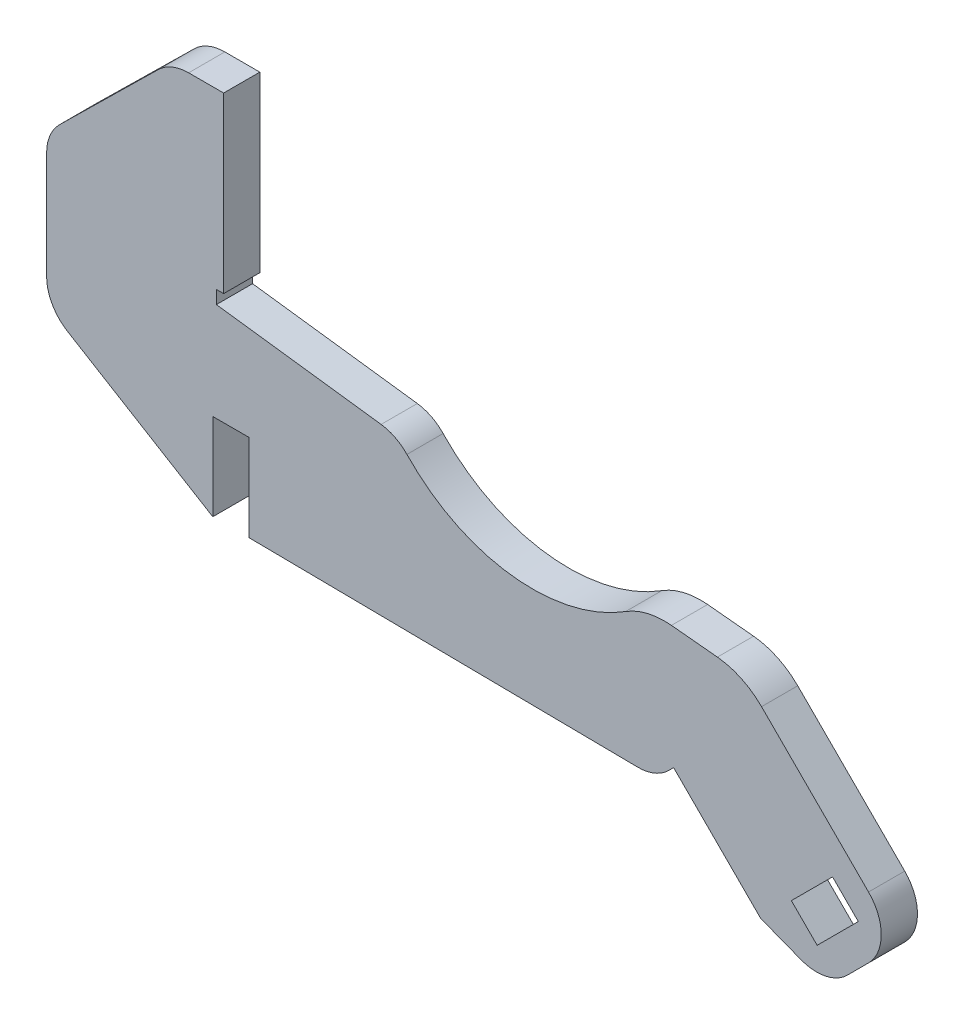
ISO-10303-21;
HEADER;
FILE_DESCRIPTION(('STEP AP214'),'2;1');
FILE_NAME('part.step','',(''),(''),'','','');
FILE_SCHEMA(('AUTOMOTIVE_DESIGN { 1 0 10303 214 1 1 1 1 }'));
ENDSEC;
DATA;
#1=APPLICATION_CONTEXT('core data for automotive mechanical design processes');
#2=APPLICATION_PROTOCOL_DEFINITION('international standard','automotive_design',2000,#1);
#3=PRODUCT_CONTEXT('',#1,'mechanical');
#4=PRODUCT('Part','Part','',(#3));
#5=PRODUCT_RELATED_PRODUCT_CATEGORY('part','',(#4));
#6=PRODUCT_DEFINITION_FORMATION('','',#4);
#7=PRODUCT_DEFINITION_CONTEXT('part definition',#1,'design');
#8=PRODUCT_DEFINITION('design','',#6,#7);
#9=PRODUCT_DEFINITION_SHAPE('','',#8);
#10=(LENGTH_UNIT() NAMED_UNIT(*) SI_UNIT(.MILLI.,.METRE.));
#11=(NAMED_UNIT(*) PLANE_ANGLE_UNIT() SI_UNIT($,.RADIAN.));
#12=(NAMED_UNIT(*) SI_UNIT($,.STERADIAN.) SOLID_ANGLE_UNIT());
#13=UNCERTAINTY_MEASURE_WITH_UNIT(LENGTH_MEASURE(1.E-05),#10,'distance_accuracy_value','');
#14=(GEOMETRIC_REPRESENTATION_CONTEXT(3) GLOBAL_UNCERTAINTY_ASSIGNED_CONTEXT((#13)) GLOBAL_UNIT_ASSIGNED_CONTEXT((#10,
#11,#12)) REPRESENTATION_CONTEXT('',''));
#15=CARTESIAN_POINT('',(0.,0.,0.));
#16=DIRECTION('',(0.,0.,1.));
#17=DIRECTION('',(1.,0.,0.));
#18=AXIS2_PLACEMENT_3D('',#15,#16,#17);
#19=CARTESIAN_POINT('',(2.08387210182843,-1.10005647116688,0.125));
#20=DIRECTION('',(0.,0.,1.));
#21=DIRECTION('',(1.,0.,0.));
#22=AXIS2_PLACEMENT_3D('',#19,#20,#21);
#23=PLANE('',#22);
#24=DIRECTION('',(-0.707106781186547,0.707106781186547,0.));
#25=VECTOR('',#24,1.);
#26=CARTESIAN_POINT('',(4.61670017436695,-3.16430284580979,0.125));
#27=LINE('',#26,#25);
#28=CARTESIAN_POINT('',(4.40456814001099,-2.95217081145382,0.125));
#29=VERTEX_POINT('',#28);
#30=CARTESIAN_POINT('',(3.6654602112381,-2.21306288268094,0.125));
#31=VERTEX_POINT('',#30);
#32=EDGE_CURVE('E311',#29,#31,#27,.T.);
#33=ORIENTED_EDGE('',*,*,#32,.T.);
#34=CARTESIAN_POINT('',(3.31190682064483,-2.56661627327421,0.125));
#35=DIRECTION('',(0.,0.,1.));
#36=DIRECTION('',(1.,0.,0.));
#37=AXIS2_PLACEMENT_3D('',#34,#35,#36);
#38=CIRCLE('',#37,0.5);
#39=CARTESIAN_POINT('',(3.36050678127505,-2.06898383479503,0.125));
#40=VERTEX_POINT('',#39);
#41=EDGE_CURVE('E40',#31,#40,#38,.T.);
#42=ORIENTED_EDGE('',*,*,#41,.T.);
#43=DIRECTION('',(-0.995264876958373,0.0971999212604389,0.));
#44=VECTOR('',#43,1.);
#45=CARTESIAN_POINT('',(3.53879301888837,-2.08639569033121,0.125));
#46=LINE('',#45,#44);
#47=CARTESIAN_POINT('',(3.04306244431306,-2.03798147022694,0.125));
#48=VERTEX_POINT('',#47);
#49=EDGE_CURVE('E313',#40,#48,#46,.T.);
#50=ORIENTED_EDGE('',*,*,#49,.T.);
#51=CARTESIAN_POINT('',(2.99446248368284,-2.53561390870612,0.125));
#52=DIRECTION('',(0.,0.,1.));
#53=DIRECTION('',(1.,0.,0.));
#54=AXIS2_PLACEMENT_3D('',#51,#52,#53);
#55=CIRCLE('',#54,0.5);
#56=CARTESIAN_POINT('',(2.72664178313742,-2.11339113295929,0.125));
#57=VERTEX_POINT('',#56);
#58=EDGE_CURVE('E47',#48,#57,#55,.T.);
#59=ORIENTED_EDGE('',*,*,#58,.T.);
#60=CARTESIAN_POINT('',(2.08387210182843,-1.10005647116688,0.125));
#61=DIRECTION('',(0.,0.,-1.));
#62=DIRECTION('',(1.,0.,0.));
#63=AXIS2_PLACEMENT_3D('',#60,#61,#62);
#64=CIRCLE('',#63,1.2);
#65=CARTESIAN_POINT('',(1.21603766591279,-1.92882869068138,0.125));
#66=VERTEX_POINT('',#65);
#67=EDGE_CURVE('E315',#57,#66,#64,.T.);
#68=ORIENTED_EDGE('',*,*,#67,.T.);
#69=CARTESIAN_POINT('',(0.999079056933884,-2.13602174556001,0.125));
#70=DIRECTION('',(0.,0.,1.));
#71=DIRECTION('',(1.,0.,0.));
#72=AXIS2_PLACEMENT_3D('',#69,#70,#71);
#73=CIRCLE('',#72,0.3);
#74=CARTESIAN_POINT('',(1.03774996099964,-1.83852458392861,0.125));
#75=VERTEX_POINT('',#74);
#76=EDGE_CURVE('E430',#66,#75,#73,.T.);
#77=ORIENTED_EDGE('',*,*,#76,.T.);
#78=DIRECTION('',(-0.991657205437985,0.128903013552536,0.));
#79=VECTOR('',#78,1.);
#80=CARTESIAN_POINT('',(1.14953079393391,-1.85305469185666,0.125));
#81=LINE('',#80,#79);
#82=CARTESIAN_POINT('',(-0.0999999999999998,-1.69063134235492,0.125));
#83=VERTEX_POINT('',#82);
#84=EDGE_CURVE('E317',#75,#83,#81,.T.);
#85=ORIENTED_EDGE('',*,*,#84,.T.);
#86=DIRECTION('',(0.,1.,0.));
#87=VECTOR('',#86,1.);
#88=CARTESIAN_POINT('',(-0.0999999999999998,-1.69063134235492,0.125));
#89=LINE('',#88,#87);
#90=CARTESIAN_POINT('',(-0.0999999999999999,-1.6,0.125));
#91=VERTEX_POINT('',#90);
#92=EDGE_CURVE('E319',#83,#91,#89,.T.);
#93=ORIENTED_EDGE('',*,*,#92,.T.);
#94=DIRECTION('',(1.,0.,0.));
#95=VECTOR('',#94,1.);
#96=CARTESIAN_POINT('',(-0.0999999999999999,-1.6,0.125));
#97=LINE('',#96,#95);
#98=CARTESIAN_POINT('',(-0.0499999999999998,-1.6,0.125));
#99=VERTEX_POINT('',#98);
#100=EDGE_CURVE('E321',#91,#99,#97,.T.);
#101=ORIENTED_EDGE('',*,*,#100,.T.);
#102=DIRECTION('',(0.,1.,0.));
#103=VECTOR('',#102,1.);
#104=CARTESIAN_POINT('',(-0.05,-0.4,0.125));
#105=LINE('',#104,#103);
#106=CARTESIAN_POINT('',(-0.05,-0.4,0.125));
#107=VERTEX_POINT('',#106);
#108=EDGE_CURVE('E323',#99,#107,#105,.T.);
#109=ORIENTED_EDGE('',*,*,#108,.T.);
#110=DIRECTION('',(-1.,0.,0.));
#111=VECTOR('',#110,1.);
#112=CARTESIAN_POINT('',(-0.05,-0.4,0.125));
#113=LINE('',#112,#111);
#114=CARTESIAN_POINT('',(-0.291663289582392,-0.4,0.125));
#115=VERTEX_POINT('',#114);
#116=EDGE_CURVE('E325',#107,#115,#113,.T.);
#117=ORIENTED_EDGE('',*,*,#116,.T.);
#118=CARTESIAN_POINT('',(-0.291663289582392,-0.7,0.125));
#119=DIRECTION('',(0.,0.,1.));
#120=DIRECTION('',(1.,0.,0.));
#121=AXIS2_PLACEMENT_3D('',#118,#119,#120);
#122=CIRCLE('',#121,0.3);
#123=CARTESIAN_POINT('',(-0.501990243174461,-0.48607811567612,0.125));
#124=VERTEX_POINT('',#123);
#125=EDGE_CURVE('E428',#115,#124,#122,.T.);
#126=ORIENTED_EDGE('',*,*,#125,.T.);
#127=DIRECTION('',(-0.713072947746268,-0.701089845306897,0.));
#128=VECTOR('',#127,1.);
#129=CARTESIAN_POINT('',(-0.414440871161026,-0.4,0.125));
#130=LINE('',#129,#128);
#131=CARTESIAN_POINT('',(-1.18302230113949,-1.15566551438029,0.125));
#132=VERTEX_POINT('',#131);
#133=EDGE_CURVE('E328',#124,#132,#130,.T.);
#134=ORIENTED_EDGE('',*,*,#133,.T.);
#135=CARTESIAN_POINT('',(-0.972695347547423,-1.36958739870417,0.125));
#136=DIRECTION('',(0.,0.,1.));
#137=DIRECTION('',(1.,0.,0.));
#138=AXIS2_PLACEMENT_3D('',#135,#136,#137);
#139=CIRCLE('',#138,0.3);
#140=CARTESIAN_POINT('',(-1.27269534754742,-1.36958739870417,0.125));
#141=VERTEX_POINT('',#140);
#142=EDGE_CURVE('E426',#132,#141,#139,.T.);
#143=ORIENTED_EDGE('',*,*,#142,.T.);
#144=DIRECTION('',(0.,-1.,0.));
#145=VECTOR('',#144,1.);
#146=CARTESIAN_POINT('',(-1.27269534754742,-1.24383161636612,0.125));
#147=LINE('',#146,#145);
#148=CARTESIAN_POINT('',(-1.27269534754742,-2.10871298110875,0.125));
#149=VERTEX_POINT('',#148);
#150=EDGE_CURVE('E286',#141,#149,#147,.T.);
#151=ORIENTED_EDGE('',*,*,#150,.T.);
#152=CARTESIAN_POINT('',(-0.972695347547423,-2.10871298110875,0.125));
#153=DIRECTION('',(0.,0.,1.));
#154=DIRECTION('',(1.,0.,0.));
#155=AXIS2_PLACEMENT_3D('',#152,#153,#154);
#156=CIRCLE('',#155,0.3);
#157=CARTESIAN_POINT('',(-1.12801596205259,-2.36537522357876,0.125));
#158=VERTEX_POINT('',#157);
#159=EDGE_CURVE('E424',#149,#158,#156,.T.);
#160=ORIENTED_EDGE('',*,*,#159,.T.);
#161=DIRECTION('',(0.855540808233388,-0.517735381683888,0.));
#162=VECTOR('',#161,1.);
#163=CARTESIAN_POINT('',(-1.27269534754742,-2.27782167131089,0.125));
#164=LINE('',#163,#162);
#165=CARTESIAN_POINT('',(-0.125,-2.97235603261887,0.125));
#166=VERTEX_POINT('',#165);
#167=EDGE_CURVE('E289',#158,#166,#164,.T.);
#168=ORIENTED_EDGE('',*,*,#167,.T.);
#169=DIRECTION('',(0.,1.,0.));
#170=VECTOR('',#169,1.);
#171=CARTESIAN_POINT('',(-0.125,-2.97235603261887,0.125));
#172=LINE('',#171,#170);
#173=CARTESIAN_POINT('',(-0.125,-2.37235603261887,0.125));
#174=VERTEX_POINT('',#173);
#175=EDGE_CURVE('E292',#166,#174,#172,.T.);
#176=ORIENTED_EDGE('',*,*,#175,.T.);
#177=DIRECTION('',(1.,0.,0.));
#178=VECTOR('',#177,1.);
#179=CARTESIAN_POINT('',(-0.125,-2.37235603261887,0.125));
#180=LINE('',#179,#178);
#181=CARTESIAN_POINT('',(0.125,-2.37235603261887,0.125));
#182=VERTEX_POINT('',#181);
#183=EDGE_CURVE('E294',#174,#182,#180,.T.);
#184=ORIENTED_EDGE('',*,*,#183,.T.);
#185=DIRECTION('',(0.,-1.,0.));
#186=VECTOR('',#185,1.);
#187=CARTESIAN_POINT('',(0.125,-2.37235603261887,0.125));
#188=LINE('',#187,#186);
#189=CARTESIAN_POINT('',(0.125,-2.97235603261887,0.125));
#190=VERTEX_POINT('',#189);
#191=EDGE_CURVE('E296',#182,#190,#188,.T.);
#192=ORIENTED_EDGE('',*,*,#191,.T.);
#193=DIRECTION('',(0.999936323133471,-0.0112849314713927,0.));
#194=VECTOR('',#193,1.);
#195=CARTESIAN_POINT('',(0.125,-2.97235603261887,0.125));
#196=LINE('',#195,#194);
#197=CARTESIAN_POINT('',(2.8093773347814,-3.0026509759723,0.125));
#198=VERTEX_POINT('',#197);
#199=EDGE_CURVE('E298',#190,#198,#196,.T.);
#200=ORIENTED_EDGE('',*,*,#199,.T.);
#201=CARTESIAN_POINT('',(2.81276281422281,-2.70267007903226,0.125));
#202=DIRECTION('',(0.,0.,1.));
#203=DIRECTION('',(1.,0.,0.));
#204=AXIS2_PLACEMENT_3D('',#201,#202,#203);
#205=CIRCLE('',#204,0.3);
#206=CARTESIAN_POINT('',(3.02489484857878,-2.91480211338822,0.125));
#207=VERTEX_POINT('',#206);
#208=EDGE_CURVE('E436',#198,#207,#205,.T.);
#209=ORIENTED_EDGE('',*,*,#208,.T.);
#210=DIRECTION('',(0.707106781186549,0.707106781186546,0.));
#211=VECTOR('',#210,1.);
#212=CARTESIAN_POINT('',(2.93562124143615,-3.00407572053085,0.125));
#213=LINE('',#212,#211);
#214=CARTESIAN_POINT('',(3.05823682863182,-2.88146013333518,0.125));
#215=VERTEX_POINT('',#214);
#216=EDGE_CURVE('E301',#207,#215,#213,.T.);
#217=ORIENTED_EDGE('',*,*,#216,.T.);
#218=DIRECTION('',(0.707106781186547,-0.707106781186547,0.));
#219=VECTOR('',#218,1.);
#220=CARTESIAN_POINT('',(3.05823682863182,-2.88146013333518,0.125));
#221=LINE('',#220,#219);
#222=CARTESIAN_POINT('',(3.65927759264038,-3.48250089734375,0.125));
#223=VERTEX_POINT('',#222);
#224=EDGE_CURVE('E303',#215,#223,#221,.T.);
#225=ORIENTED_EDGE('',*,*,#224,.T.);
#226=DIRECTION('',(0.93275440568332,-0.360512439006419,0.));
#227=VECTOR('',#226,1.);
#228=CARTESIAN_POINT('',(3.65927759264038,-3.48250089734375,0.125));
#229=LINE('',#228,#227);
#230=CARTESIAN_POINT('',(3.93813240410876,-3.59027913735913,0.125));
#231=VERTEX_POINT('',#230);
#232=EDGE_CURVE('E305',#223,#231,#229,.T.);
#233=ORIENTED_EDGE('',*,*,#232,.T.);
#234=CARTESIAN_POINT('',(4.04628613581068,-3.31045281565413,0.125));
#235=DIRECTION('',(0.,0.,1.));
#236=DIRECTION('',(1.,0.,0.));
#237=AXIS2_PLACEMENT_3D('',#234,#235,#236);
#238=CIRCLE('',#237,0.3);
#239=CARTESIAN_POINT('',(4.25841817016665,-3.52258485001009,0.125));
#240=VERTEX_POINT('',#239);
#241=EDGE_CURVE('E432',#231,#240,#238,.T.);
#242=ORIENTED_EDGE('',*,*,#241,.T.);
#243=DIRECTION('',(0.707106781186547,0.707106781186548,0.));
#244=VECTOR('',#243,1.);
#245=CARTESIAN_POINT('',(4.120311213974,-3.66069180620274,0.125));
#246=LINE('',#245,#244);
#247=CARTESIAN_POINT('',(4.40456814001099,-3.37643488016575,0.125));
#248=VERTEX_POINT('',#247);
#249=EDGE_CURVE('E308',#240,#248,#246,.T.);
#250=ORIENTED_EDGE('',*,*,#249,.T.);
#251=CARTESIAN_POINT('',(4.19243610565503,-3.16430284580979,0.125));
#252=DIRECTION('',(0.,0.,1.));
#253=DIRECTION('',(1.,0.,0.));
#254=AXIS2_PLACEMENT_3D('',#251,#252,#253);
#255=CIRCLE('',#254,0.3);
#256=EDGE_CURVE('E434',#248,#29,#255,.T.);
#257=ORIENTED_EDGE('',*,*,#256,.T.);
#258=EDGE_LOOP('',(#33,#42,#50,#59,#68,#77,#85,#93,#101,#109,#117,#126,#134,#143,#151,#160,#168,
#176,#184,#192,#200,#209,#217,#225,#233,#242,#250,#257));
#259=FACE_BOUND('',#258,.T.);
#260=DIRECTION('',(0.707106781186545,-0.70710678118655,0.));
#261=VECTOR('',#260,1.);
#262=CARTESIAN_POINT('',(3.87140962699635,-3.27036886298778,0.125));
#263=LINE('',#262,#261);
#264=CARTESIAN_POINT('',(3.87140962699635,-3.27036886298778,0.125));
#265=VERTEX_POINT('',#264);
#266=CARTESIAN_POINT('',(4.04960053585534,-3.44855977184678,0.125));
#267=VERTEX_POINT('',#266);
#268=EDGE_CURVE('E255',#265,#267,#263,.T.);
#269=ORIENTED_EDGE('',*,*,#268,.F.);
#270=DIRECTION('',(-0.707106781186509,-0.707106781186586,0.));
#271=VECTOR('',#270,1.);
#272=CARTESIAN_POINT('',(3.87140962699635,-3.27036886298778,0.125));
#273=LINE('',#272,#271);
#274=CARTESIAN_POINT('',(4.15566655303332,-2.98611193695078,0.125));
#275=VERTEX_POINT('',#274);
#276=EDGE_CURVE('E245',#275,#265,#273,.T.);
#277=ORIENTED_EDGE('',*,*,#276,.F.);
#278=DIRECTION('',(-0.707106781186543,0.707106781186552,0.));
#279=VECTOR('',#278,1.);
#280=CARTESIAN_POINT('',(4.15566655303332,-2.98611193695078,0.125));
#281=LINE('',#280,#279);
#282=CARTESIAN_POINT('',(4.33385746189233,-3.16430284580979,0.125));
#283=VERTEX_POINT('',#282);
#284=EDGE_CURVE('E270',#283,#275,#281,.T.);
#285=ORIENTED_EDGE('',*,*,#284,.F.);
#286=DIRECTION('',(0.707106781186547,0.707106781186549,0.));
#287=VECTOR('',#286,1.);
#288=CARTESIAN_POINT('',(4.04960053585534,-3.44855977184678,0.125));
#289=LINE('',#288,#287);
#290=EDGE_CURVE('E268',#267,#283,#289,.T.);
#291=ORIENTED_EDGE('',*,*,#290,.F.);
#292=EDGE_LOOP('',(#269,#277,#285,#291));
#293=FACE_BOUND('',#292,.T.);
#294=ADVANCED_FACE('F32',(#259,#293),#23,.T.);
#295=CARTESIAN_POINT('',(2.08387210182843,-1.10005647116688,-0.125));
#296=DIRECTION('',(0.,0.,1.));
#297=DIRECTION('',(1.,0.,0.));
#298=AXIS2_PLACEMENT_3D('',#295,#296,#297);
#299=PLANE('',#298);
#300=DIRECTION('',(-0.995264876958373,0.0971999212604389,0.));
#301=VECTOR('',#300,1.);
#302=CARTESIAN_POINT('',(3.53879301888837,-2.08639569033121,-0.125));
#303=LINE('',#302,#301);
#304=CARTESIAN_POINT('',(3.36050678127505,-2.06898383479503,-0.125));
#305=VERTEX_POINT('',#304);
#306=CARTESIAN_POINT('',(3.04306244431306,-2.03798147022694,-0.125));
#307=VERTEX_POINT('',#306);
#308=EDGE_CURVE('E357',#305,#307,#303,.T.);
#309=ORIENTED_EDGE('',*,*,#308,.F.);
#310=CARTESIAN_POINT('',(3.31190682064483,-2.56661627327421,-0.125));
#311=DIRECTION('',(0.,0.,1.));
#312=DIRECTION('',(1.,0.,0.));
#313=AXIS2_PLACEMENT_3D('',#310,#311,#312);
#314=CIRCLE('',#313,0.5);
#315=CARTESIAN_POINT('',(3.6654602112381,-2.21306288268094,-0.125));
#316=VERTEX_POINT('',#315);
#317=EDGE_CURVE('E476',#305,#316,#314,.F.);
#318=ORIENTED_EDGE('',*,*,#317,.T.);
#319=DIRECTION('',(-0.707106781186547,0.707106781186547,0.));
#320=VECTOR('',#319,1.);
#321=CARTESIAN_POINT('',(4.61670017436695,-3.16430284580979,-0.125));
#322=LINE('',#321,#320);
#323=CARTESIAN_POINT('',(4.40456814001099,-2.95217081145382,-0.125));
#324=VERTEX_POINT('',#323);
#325=EDGE_CURVE('E355',#324,#316,#322,.T.);
#326=ORIENTED_EDGE('',*,*,#325,.F.);
#327=CARTESIAN_POINT('',(4.19243610565503,-3.16430284580979,-0.125));
#328=DIRECTION('',(0.,0.,1.));
#329=DIRECTION('',(1.,0.,0.));
#330=AXIS2_PLACEMENT_3D('',#327,#328,#329);
#331=CIRCLE('',#330,0.3);
#332=CARTESIAN_POINT('',(4.40456814001099,-3.37643488016575,-0.125));
#333=VERTEX_POINT('',#332);
#334=EDGE_CURVE('E418',#324,#333,#331,.F.);
#335=ORIENTED_EDGE('',*,*,#334,.T.);
#336=DIRECTION('',(0.707106781186547,0.707106781186548,0.));
#337=VECTOR('',#336,1.);
#338=CARTESIAN_POINT('',(4.120311213974,-3.66069180620274,-0.125));
#339=LINE('',#338,#337);
#340=CARTESIAN_POINT('',(4.25841817016665,-3.52258485001009,-0.125));
#341=VERTEX_POINT('',#340);
#342=EDGE_CURVE('E352',#341,#333,#339,.T.);
#343=ORIENTED_EDGE('',*,*,#342,.F.);
#344=CARTESIAN_POINT('',(4.04628613581068,-3.31045281565413,-0.125));
#345=DIRECTION('',(0.,0.,1.));
#346=DIRECTION('',(1.,0.,0.));
#347=AXIS2_PLACEMENT_3D('',#344,#345,#346);
#348=CIRCLE('',#347,0.3);
#349=CARTESIAN_POINT('',(3.93813240410876,-3.59027913735913,-0.125));
#350=VERTEX_POINT('',#349);
#351=EDGE_CURVE('E416',#341,#350,#348,.F.);
#352=ORIENTED_EDGE('',*,*,#351,.T.);
#353=DIRECTION('',(0.93275440568332,-0.360512439006419,0.));
#354=VECTOR('',#353,1.);
#355=CARTESIAN_POINT('',(3.65927759264038,-3.48250089734375,-0.125));
#356=LINE('',#355,#354);
#357=CARTESIAN_POINT('',(3.65927759264038,-3.48250089734375,-0.125));
#358=VERTEX_POINT('',#357);
#359=EDGE_CURVE('E349',#358,#350,#356,.T.);
#360=ORIENTED_EDGE('',*,*,#359,.F.);
#361=DIRECTION('',(0.707106781186547,-0.707106781186547,0.));
#362=VECTOR('',#361,1.);
#363=CARTESIAN_POINT('',(3.05823682863182,-2.88146013333518,-0.125));
#364=LINE('',#363,#362);
#365=CARTESIAN_POINT('',(3.05823682863182,-2.88146013333518,-0.125));
#366=VERTEX_POINT('',#365);
#367=EDGE_CURVE('E347',#366,#358,#364,.T.);
#368=ORIENTED_EDGE('',*,*,#367,.F.);
#369=DIRECTION('',(0.707106781186549,0.707106781186546,0.));
#370=VECTOR('',#369,1.);
#371=CARTESIAN_POINT('',(2.93562124143615,-3.00407572053085,-0.125));
#372=LINE('',#371,#370);
#373=CARTESIAN_POINT('',(3.02489484857878,-2.91480211338822,-0.125));
#374=VERTEX_POINT('',#373);
#375=EDGE_CURVE('E345',#374,#366,#372,.T.);
#376=ORIENTED_EDGE('',*,*,#375,.F.);
#377=CARTESIAN_POINT('',(2.81276281422281,-2.70267007903226,-0.125));
#378=DIRECTION('',(0.,0.,1.));
#379=DIRECTION('',(1.,0.,0.));
#380=AXIS2_PLACEMENT_3D('',#377,#378,#379);
#381=CIRCLE('',#380,0.3);
#382=CARTESIAN_POINT('',(2.8093773347814,-3.0026509759723,-0.125));
#383=VERTEX_POINT('',#382);
#384=EDGE_CURVE('E420',#374,#383,#381,.F.);
#385=ORIENTED_EDGE('',*,*,#384,.T.);
#386=DIRECTION('',(0.999936323133471,-0.0112849314713927,0.));
#387=VECTOR('',#386,1.);
#388=CARTESIAN_POINT('',(0.125,-2.97235603261887,-0.125));
#389=LINE('',#388,#387);
#390=CARTESIAN_POINT('',(0.125,-2.97235603261887,-0.125));
#391=VERTEX_POINT('',#390);
#392=EDGE_CURVE('E342',#391,#383,#389,.T.);
#393=ORIENTED_EDGE('',*,*,#392,.F.);
#394=DIRECTION('',(0.,-1.,0.));
#395=VECTOR('',#394,1.);
#396=CARTESIAN_POINT('',(0.125,-2.37235603261887,-0.125));
#397=LINE('',#396,#395);
#398=CARTESIAN_POINT('',(0.125,-2.37235603261887,-0.125));
#399=VERTEX_POINT('',#398);
#400=EDGE_CURVE('E340',#399,#391,#397,.T.);
#401=ORIENTED_EDGE('',*,*,#400,.F.);
#402=DIRECTION('',(1.,0.,0.));
#403=VECTOR('',#402,1.);
#404=CARTESIAN_POINT('',(-0.125,-2.37235603261887,-0.125));
#405=LINE('',#404,#403);
#406=CARTESIAN_POINT('',(-0.125,-2.37235603261887,-0.125));
#407=VERTEX_POINT('',#406);
#408=EDGE_CURVE('E338',#407,#399,#405,.T.);
#409=ORIENTED_EDGE('',*,*,#408,.F.);
#410=DIRECTION('',(0.,1.,0.));
#411=VECTOR('',#410,1.);
#412=CARTESIAN_POINT('',(-0.125,-2.97235603261887,-0.125));
#413=LINE('',#412,#411);
#414=CARTESIAN_POINT('',(-0.125,-2.97235603261887,-0.125));
#415=VERTEX_POINT('',#414);
#416=EDGE_CURVE('E336',#415,#407,#413,.T.);
#417=ORIENTED_EDGE('',*,*,#416,.F.);
#418=DIRECTION('',(0.855540808233388,-0.517735381683888,0.));
#419=VECTOR('',#418,1.);
#420=CARTESIAN_POINT('',(-1.27269534754742,-2.27782167131089,-0.125));
#421=LINE('',#420,#419);
#422=CARTESIAN_POINT('',(-1.12801596205259,-2.36537522357876,-0.125));
#423=VERTEX_POINT('',#422);
#424=EDGE_CURVE('E334',#423,#415,#421,.T.);
#425=ORIENTED_EDGE('',*,*,#424,.F.);
#426=CARTESIAN_POINT('',(-0.972695347547423,-2.10871298110875,-0.125));
#427=DIRECTION('',(0.,0.,1.));
#428=DIRECTION('',(1.,0.,0.));
#429=AXIS2_PLACEMENT_3D('',#426,#427,#428);
#430=CIRCLE('',#429,0.3);
#431=CARTESIAN_POINT('',(-1.27269534754742,-2.10871298110875,-0.125));
#432=VERTEX_POINT('',#431);
#433=EDGE_CURVE('E407',#423,#432,#430,.F.);
#434=ORIENTED_EDGE('',*,*,#433,.T.);
#435=DIRECTION('',(0.,-1.,0.));
#436=VECTOR('',#435,1.);
#437=CARTESIAN_POINT('',(-1.27269534754742,-1.24383161636612,-0.125));
#438=LINE('',#437,#436);
#439=CARTESIAN_POINT('',(-1.27269534754742,-1.36958739870417,-0.125));
#440=VERTEX_POINT('',#439);
#441=EDGE_CURVE('E263',#440,#432,#438,.T.);
#442=ORIENTED_EDGE('',*,*,#441,.F.);
#443=CARTESIAN_POINT('',(-0.972695347547423,-1.36958739870417,-0.125));
#444=DIRECTION('',(0.,0.,1.));
#445=DIRECTION('',(1.,0.,0.));
#446=AXIS2_PLACEMENT_3D('',#443,#444,#445);
#447=CIRCLE('',#446,0.3);
#448=CARTESIAN_POINT('',(-1.18302230113949,-1.15566551438029,-0.125));
#449=VERTEX_POINT('',#448);
#450=EDGE_CURVE('E409',#440,#449,#447,.F.);
#451=ORIENTED_EDGE('',*,*,#450,.T.);
#452=DIRECTION('',(-0.713072947746268,-0.701089845306897,0.));
#453=VECTOR('',#452,1.);
#454=CARTESIAN_POINT('',(-0.414440871161026,-0.4,-0.125));
#455=LINE('',#454,#453);
#456=CARTESIAN_POINT('',(-0.501990243174461,-0.48607811567612,-0.125));
#457=VERTEX_POINT('',#456);
#458=EDGE_CURVE('E290',#457,#449,#455,.T.);
#459=ORIENTED_EDGE('',*,*,#458,.F.);
#460=CARTESIAN_POINT('',(-0.291663289582392,-0.7,-0.125));
#461=DIRECTION('',(0.,0.,1.));
#462=DIRECTION('',(1.,0.,0.));
#463=AXIS2_PLACEMENT_3D('',#460,#461,#462);
#464=CIRCLE('',#463,0.3);
#465=CARTESIAN_POINT('',(-0.291663289582392,-0.4,-0.125));
#466=VERTEX_POINT('',#465);
#467=EDGE_CURVE('E411',#457,#466,#464,.F.);
#468=ORIENTED_EDGE('',*,*,#467,.T.);
#469=DIRECTION('',(-1.,0.,0.));
#470=VECTOR('',#469,1.);
#471=CARTESIAN_POINT('',(-0.05,-0.4,-0.125));
#472=LINE('',#471,#470);
#473=CARTESIAN_POINT('',(-0.05,-0.4,-0.125));
#474=VERTEX_POINT('',#473);
#475=EDGE_CURVE('E370',#474,#466,#472,.T.);
#476=ORIENTED_EDGE('',*,*,#475,.F.);
#477=DIRECTION('',(0.,1.,0.));
#478=VECTOR('',#477,1.);
#479=CARTESIAN_POINT('',(-0.05,-0.4,-0.125));
#480=LINE('',#479,#478);
#481=CARTESIAN_POINT('',(-0.0499999999999998,-1.6,-0.125));
#482=VERTEX_POINT('',#481);
#483=EDGE_CURVE('E368',#482,#474,#480,.T.);
#484=ORIENTED_EDGE('',*,*,#483,.F.);
#485=DIRECTION('',(1.,0.,0.));
#486=VECTOR('',#485,1.);
#487=CARTESIAN_POINT('',(-0.0999999999999999,-1.6,-0.125));
#488=LINE('',#487,#486);
#489=CARTESIAN_POINT('',(-0.0999999999999999,-1.6,-0.125));
#490=VERTEX_POINT('',#489);
#491=EDGE_CURVE('E366',#490,#482,#488,.T.);
#492=ORIENTED_EDGE('',*,*,#491,.F.);
#493=DIRECTION('',(0.,1.,0.));
#494=VECTOR('',#493,1.);
#495=CARTESIAN_POINT('',(-0.0999999999999998,-1.69063134235492,-0.125));
#496=LINE('',#495,#494);
#497=CARTESIAN_POINT('',(-0.0999999999999998,-1.69063134235492,-0.125));
#498=VERTEX_POINT('',#497);
#499=EDGE_CURVE('E364',#498,#490,#496,.T.);
#500=ORIENTED_EDGE('',*,*,#499,.F.);
#501=DIRECTION('',(-0.991657205437985,0.128903013552536,0.));
#502=VECTOR('',#501,1.);
#503=CARTESIAN_POINT('',(1.14953079393391,-1.85305469185666,-0.125));
#504=LINE('',#503,#502);
#505=CARTESIAN_POINT('',(1.03774996099964,-1.83852458392861,-0.125));
#506=VERTEX_POINT('',#505);
#507=EDGE_CURVE('E362',#506,#498,#504,.T.);
#508=ORIENTED_EDGE('',*,*,#507,.F.);
#509=CARTESIAN_POINT('',(0.999079056933884,-2.13602174556001,-0.125));
#510=DIRECTION('',(0.,0.,1.));
#511=DIRECTION('',(1.,0.,0.));
#512=AXIS2_PLACEMENT_3D('',#509,#510,#511);
#513=CIRCLE('',#512,0.3);
#514=CARTESIAN_POINT('',(1.21603766591279,-1.92882869068138,-0.125));
#515=VERTEX_POINT('',#514);
#516=EDGE_CURVE('E413',#506,#515,#513,.F.);
#517=ORIENTED_EDGE('',*,*,#516,.T.);
#518=CARTESIAN_POINT('',(2.08387210182843,-1.10005647116688,-0.125));
#519=DIRECTION('',(0.,0.,-1.));
#520=DIRECTION('',(1.,0.,0.));
#521=AXIS2_PLACEMENT_3D('',#518,#519,#520);
#522=CIRCLE('',#521,1.2);
#523=CARTESIAN_POINT('',(2.72664178313742,-2.11339113295929,-0.125));
#524=VERTEX_POINT('',#523);
#525=EDGE_CURVE('E360',#524,#515,#522,.T.);
#526=ORIENTED_EDGE('',*,*,#525,.F.);
#527=CARTESIAN_POINT('',(2.99446248368284,-2.53561390870612,-0.125));
#528=DIRECTION('',(0.,0.,1.));
#529=DIRECTION('',(1.,0.,0.));
#530=AXIS2_PLACEMENT_3D('',#527,#528,#529);
#531=CIRCLE('',#530,0.5);
#532=EDGE_CURVE('E474',#524,#307,#531,.F.);
#533=ORIENTED_EDGE('',*,*,#532,.T.);
#534=EDGE_LOOP('',(#309,#318,#326,#335,#343,#352,#360,#368,#376,#385,#393,#401,#409,#417,#425,
#434,#442,#451,#459,#468,#476,#484,#492,#500,#508,#517,#526,#533));
#535=FACE_BOUND('',#534,.T.);
#536=DIRECTION('',(-0.707106781186509,-0.707106781186586,0.));
#537=VECTOR('',#536,1.);
#538=CARTESIAN_POINT('',(3.87140962699635,-3.27036886298778,-0.125));
#539=LINE('',#538,#537);
#540=CARTESIAN_POINT('',(4.15566655303332,-2.98611193695078,-0.125));
#541=VERTEX_POINT('',#540);
#542=CARTESIAN_POINT('',(3.87140962699635,-3.27036886298778,-0.125));
#543=VERTEX_POINT('',#542);
#544=EDGE_CURVE('E274',#541,#543,#539,.T.);
#545=ORIENTED_EDGE('',*,*,#544,.T.);
#546=DIRECTION('',(0.707106781186545,-0.70710678118655,0.));
#547=VECTOR('',#546,1.);
#548=CARTESIAN_POINT('',(3.87140962699635,-3.27036886298778,-0.125));
#549=LINE('',#548,#547);
#550=CARTESIAN_POINT('',(4.04960053585534,-3.44855977184678,-0.125));
#551=VERTEX_POINT('',#550);
#552=EDGE_CURVE('E262',#543,#551,#549,.T.);
#553=ORIENTED_EDGE('',*,*,#552,.T.);
#554=DIRECTION('',(0.707106781186547,0.707106781186549,0.));
#555=VECTOR('',#554,1.);
#556=CARTESIAN_POINT('',(4.04960053585534,-3.44855977184678,-0.125));
#557=LINE('',#556,#555);
#558=CARTESIAN_POINT('',(4.33385746189233,-3.16430284580979,-0.125));
#559=VERTEX_POINT('',#558);
#560=EDGE_CURVE('E277',#551,#559,#557,.T.);
#561=ORIENTED_EDGE('',*,*,#560,.T.);
#562=DIRECTION('',(-0.707106781186543,0.707106781186552,0.));
#563=VECTOR('',#562,1.);
#564=CARTESIAN_POINT('',(4.15566655303332,-2.98611193695078,-0.125));
#565=LINE('',#564,#563);
#566=EDGE_CURVE('E256',#559,#541,#565,.T.);
#567=ORIENTED_EDGE('',*,*,#566,.T.);
#568=EDGE_LOOP('',(#545,#553,#561,#567));
#569=FACE_BOUND('',#568,.T.);
#570=ADVANCED_FACE('F490',(#535,#569),#299,.F.);
#571=CARTESIAN_POINT('',(-1.27269534754742,-1.24383161636612,0.125));
#572=DIRECTION('',(1.,0.,0.));
#573=DIRECTION('',(0.,0.,-1.));
#574=AXIS2_PLACEMENT_3D('',#571,#572,#573);
#575=PLANE('',#574);
#576=ORIENTED_EDGE('',*,*,#150,.F.);
#577=DIRECTION('',(0.,0.,-1.));
#578=VECTOR('',#577,1.);
#579=CARTESIAN_POINT('',(-1.27269534754742,-1.36958739870417,0.125));
#580=LINE('',#579,#578);
#581=EDGE_CURVE('E463',#141,#440,#580,.T.);
#582=ORIENTED_EDGE('',*,*,#581,.T.);
#583=ORIENTED_EDGE('',*,*,#441,.T.);
#584=DIRECTION('',(0.,0.,-1.));
#585=VECTOR('',#584,1.);
#586=CARTESIAN_POINT('',(-1.27269534754742,-2.10871298110875,0.125));
#587=LINE('',#586,#585);
#588=EDGE_CURVE('E461',#432,#149,#587,.F.);
#589=ORIENTED_EDGE('',*,*,#588,.T.);
#590=EDGE_LOOP('',(#576,#582,#583,#589));
#591=FACE_BOUND('',#590,.T.);
#592=ADVANCED_FACE('F556',(#591),#575,.F.);
#593=CARTESIAN_POINT('',(-1.27269534754742,-2.27782167131089,0.125));
#594=DIRECTION('',(0.517735381683888,0.855540808233388,0.));
#595=DIRECTION('',(-0.855540808233388,0.517735381683888,0.));
#596=AXIS2_PLACEMENT_3D('',#593,#594,#595);
#597=PLANE('',#596);
#598=ORIENTED_EDGE('',*,*,#167,.F.);
#599=DIRECTION('',(0.,0.,-1.));
#600=VECTOR('',#599,1.);
#601=CARTESIAN_POINT('',(-1.12801596205259,-2.36537522357876,0.125));
#602=LINE('',#601,#600);
#603=EDGE_CURVE('E466',#158,#423,#602,.T.);
#604=ORIENTED_EDGE('',*,*,#603,.T.);
#605=ORIENTED_EDGE('',*,*,#424,.T.);
#606=DIRECTION('',(0.,0.,-1.));
#607=VECTOR('',#606,1.);
#608=CARTESIAN_POINT('',(-0.125,-2.97235603261887,0.125));
#609=LINE('',#608,#607);
#610=EDGE_CURVE('E401',#166,#415,#609,.T.);
#611=ORIENTED_EDGE('',*,*,#610,.F.);
#612=EDGE_LOOP('',(#598,#604,#605,#611));
#613=FACE_BOUND('',#612,.T.);
#614=ADVANCED_FACE('F549',(#613),#597,.F.);
#615=CARTESIAN_POINT('',(-0.125,-2.97235603261887,0.125));
#616=DIRECTION('',(-1.,0.,0.));
#617=DIRECTION('',(0.,0.,1.));
#618=AXIS2_PLACEMENT_3D('',#615,#616,#617);
#619=PLANE('',#618);
#620=ORIENTED_EDGE('',*,*,#416,.T.);
#621=DIRECTION('',(0.,0.,-1.));
#622=VECTOR('',#621,1.);
#623=CARTESIAN_POINT('',(-0.125,-2.37235603261887,0.125));
#624=LINE('',#623,#622);
#625=EDGE_CURVE('E398',#174,#407,#624,.T.);
#626=ORIENTED_EDGE('',*,*,#625,.F.);
#627=ORIENTED_EDGE('',*,*,#175,.F.);
#628=ORIENTED_EDGE('',*,*,#610,.T.);
#629=EDGE_LOOP('',(#620,#626,#627,#628));
#630=FACE_BOUND('',#629,.T.);
#631=ADVANCED_FACE('F545',(#630),#619,.F.);
#632=CARTESIAN_POINT('',(-0.125,-2.37235603261887,0.125));
#633=DIRECTION('',(0.,1.,0.));
#634=DIRECTION('',(0.,0.,1.));
#635=AXIS2_PLACEMENT_3D('',#632,#633,#634);
#636=PLANE('',#635);
#637=ORIENTED_EDGE('',*,*,#408,.T.);
#638=DIRECTION('',(0.,0.,-1.));
#639=VECTOR('',#638,1.);
#640=CARTESIAN_POINT('',(0.125,-2.37235603261887,0.125));
#641=LINE('',#640,#639);
#642=EDGE_CURVE('E395',#182,#399,#641,.T.);
#643=ORIENTED_EDGE('',*,*,#642,.F.);
#644=ORIENTED_EDGE('',*,*,#183,.F.);
#645=ORIENTED_EDGE('',*,*,#625,.T.);
#646=EDGE_LOOP('',(#637,#643,#644,#645));
#647=FACE_BOUND('',#646,.T.);
#648=ADVANCED_FACE('F541',(#647),#636,.F.);
#649=CARTESIAN_POINT('',(0.125,-2.37235603261887,0.125));
#650=DIRECTION('',(1.,0.,0.));
#651=DIRECTION('',(0.,0.,-1.));
#652=AXIS2_PLACEMENT_3D('',#649,#650,#651);
#653=PLANE('',#652);
#654=ORIENTED_EDGE('',*,*,#400,.T.);
#655=DIRECTION('',(0.,0.,-1.));
#656=VECTOR('',#655,1.);
#657=CARTESIAN_POINT('',(0.125,-2.97235603261887,0.125));
#658=LINE('',#657,#656);
#659=EDGE_CURVE('E392',#190,#391,#658,.T.);
#660=ORIENTED_EDGE('',*,*,#659,.F.);
#661=ORIENTED_EDGE('',*,*,#191,.F.);
#662=ORIENTED_EDGE('',*,*,#642,.T.);
#663=EDGE_LOOP('',(#654,#660,#661,#662));
#664=FACE_BOUND('',#663,.T.);
#665=ADVANCED_FACE('F535',(#664),#653,.F.);
#666=CARTESIAN_POINT('',(0.125,-2.97235603261887,0.125));
#667=DIRECTION('',(0.0112849314713927,0.999936323133471,0.));
#668=DIRECTION('',(-0.999936323133471,0.0112849314713927,0.));
#669=AXIS2_PLACEMENT_3D('',#666,#667,#668);
#670=PLANE('',#669);
#671=ORIENTED_EDGE('',*,*,#392,.T.);
#672=DIRECTION('',(0.,0.,-1.));
#673=VECTOR('',#672,1.);
#674=CARTESIAN_POINT('',(2.8093773347814,-3.0026509759723,0.125));
#675=LINE('',#674,#673);
#676=EDGE_CURVE('E422',#383,#198,#675,.F.);
#677=ORIENTED_EDGE('',*,*,#676,.T.);
#678=ORIENTED_EDGE('',*,*,#199,.F.);
#679=ORIENTED_EDGE('',*,*,#659,.T.);
#680=EDGE_LOOP('',(#671,#677,#678,#679));
#681=FACE_BOUND('',#680,.T.);
#682=ADVANCED_FACE('F529',(#681),#670,.F.);
#683=CARTESIAN_POINT('',(2.93562124143615,-3.00407572053085,0.125));
#684=DIRECTION('',(-0.707106781186546,0.707106781186549,0.));
#685=DIRECTION('',(-0.707106781186549,-0.707106781186546,0.));
#686=AXIS2_PLACEMENT_3D('',#683,#684,#685);
#687=PLANE('',#686);
#688=ORIENTED_EDGE('',*,*,#216,.F.);
#689=DIRECTION('',(0.,0.,-1.));
#690=VECTOR('',#689,1.);
#691=CARTESIAN_POINT('',(3.02489484857878,-2.91480211338822,0.125));
#692=LINE('',#691,#690);
#693=EDGE_CURVE('E404',#207,#374,#692,.T.);
#694=ORIENTED_EDGE('',*,*,#693,.T.);
#695=ORIENTED_EDGE('',*,*,#375,.T.);
#696=DIRECTION('',(0.,0.,-1.));
#697=VECTOR('',#696,1.);
#698=CARTESIAN_POINT('',(3.05823682863182,-2.88146013333518,0.125));
#699=LINE('',#698,#697);
#700=EDGE_CURVE('E389',#215,#366,#699,.T.);
#701=ORIENTED_EDGE('',*,*,#700,.F.);
#702=EDGE_LOOP('',(#688,#694,#695,#701));
#703=FACE_BOUND('',#702,.T.);
#704=ADVANCED_FACE('F521',(#703),#687,.F.);
#705=CARTESIAN_POINT('',(3.05823682863182,-2.88146013333518,0.125));
#706=DIRECTION('',(0.707106781186547,0.707106781186547,0.));
#707=DIRECTION('',(-0.707106781186548,0.707106781186548,0.));
#708=AXIS2_PLACEMENT_3D('',#705,#706,#707);
#709=PLANE('',#708);
#710=ORIENTED_EDGE('',*,*,#367,.T.);
#711=DIRECTION('',(0.,0.,-1.));
#712=VECTOR('',#711,1.);
#713=CARTESIAN_POINT('',(3.65927759264038,-3.48250089734375,0.125));
#714=LINE('',#713,#712);
#715=EDGE_CURVE('E386',#223,#358,#714,.T.);
#716=ORIENTED_EDGE('',*,*,#715,.F.);
#717=ORIENTED_EDGE('',*,*,#224,.F.);
#718=ORIENTED_EDGE('',*,*,#700,.T.);
#719=EDGE_LOOP('',(#710,#716,#717,#718));
#720=FACE_BOUND('',#719,.T.);
#721=ADVANCED_FACE('F515',(#720),#709,.F.);
#722=CARTESIAN_POINT('',(3.65927759264038,-3.48250089734375,0.125));
#723=DIRECTION('',(0.360512439006419,0.93275440568332,0.));
#724=DIRECTION('',(-0.93275440568332,0.360512439006419,0.));
#725=AXIS2_PLACEMENT_3D('',#722,#723,#724);
#726=PLANE('',#725);
#727=ORIENTED_EDGE('',*,*,#359,.T.);
#728=DIRECTION('',(0.,0.,-1.));
#729=VECTOR('',#728,1.);
#730=CARTESIAN_POINT('',(3.93813240410876,-3.59027913735913,0.125));
#731=LINE('',#730,#729);
#732=EDGE_CURVE('E446',#350,#231,#731,.F.);
#733=ORIENTED_EDGE('',*,*,#732,.T.);
#734=ORIENTED_EDGE('',*,*,#232,.F.);
#735=ORIENTED_EDGE('',*,*,#715,.T.);
#736=EDGE_LOOP('',(#727,#733,#734,#735));
#737=FACE_BOUND('',#736,.T.);
#738=ADVANCED_FACE('F510',(#737),#726,.F.);
#739=CARTESIAN_POINT('',(4.120311213974,-3.66069180620274,0.125));
#740=DIRECTION('',(-0.707106781186548,0.707106781186547,0.));
#741=DIRECTION('',(-0.707106781186547,-0.707106781186548,0.));
#742=AXIS2_PLACEMENT_3D('',#739,#740,#741);
#743=PLANE('',#742);
#744=ORIENTED_EDGE('',*,*,#342,.T.);
#745=DIRECTION('',(0.,0.,-1.));
#746=VECTOR('',#745,1.);
#747=CARTESIAN_POINT('',(4.40456814001099,-3.37643488016575,0.125));
#748=LINE('',#747,#746);
#749=EDGE_CURVE('E444',#333,#248,#748,.F.);
#750=ORIENTED_EDGE('',*,*,#749,.T.);
#751=ORIENTED_EDGE('',*,*,#249,.F.);
#752=DIRECTION('',(0.,0.,-1.));
#753=VECTOR('',#752,1.);
#754=CARTESIAN_POINT('',(4.25841817016665,-3.52258485001009,0.125));
#755=LINE('',#754,#753);
#756=EDGE_CURVE('E441',#240,#341,#755,.T.);
#757=ORIENTED_EDGE('',*,*,#756,.T.);
#758=EDGE_LOOP('',(#744,#750,#751,#757));
#759=FACE_BOUND('',#758,.T.);
#760=ADVANCED_FACE('F500',(#759),#743,.F.);
#761=CARTESIAN_POINT('',(4.61670017436695,-3.16430284580979,0.125));
#762=DIRECTION('',(-0.707106781186547,-0.707106781186547,0.));
#763=DIRECTION('',(0.707106781186548,-0.707106781186548,0.));
#764=AXIS2_PLACEMENT_3D('',#761,#762,#763);
#765=PLANE('',#764);
#766=ORIENTED_EDGE('',*,*,#325,.T.);
#767=DIRECTION('',(0.,0.,-1.));
#768=VECTOR('',#767,1.);
#769=CARTESIAN_POINT('',(3.6654602112381,-2.21306288268094,0.125));
#770=LINE('',#769,#768);
#771=EDGE_CURVE('E55',#316,#31,#770,.F.);
#772=ORIENTED_EDGE('',*,*,#771,.T.);
#773=ORIENTED_EDGE('',*,*,#32,.F.);
#774=DIRECTION('',(0.,0.,-1.));
#775=VECTOR('',#774,1.);
#776=CARTESIAN_POINT('',(4.40456814001099,-2.95217081145382,0.125));
#777=LINE('',#776,#775);
#778=EDGE_CURVE('E438',#29,#324,#777,.T.);
#779=ORIENTED_EDGE('',*,*,#778,.T.);
#780=EDGE_LOOP('',(#766,#772,#773,#779));
#781=FACE_BOUND('',#780,.T.);
#782=ADVANCED_FACE('F492',(#781),#765,.F.);
#783=CARTESIAN_POINT('',(3.53879301888837,-2.08639569033121,0.125));
#784=DIRECTION('',(-0.0971999212604389,-0.995264876958373,0.));
#785=DIRECTION('',(0.995264876958373,-0.0971999212604389,0.));
#786=AXIS2_PLACEMENT_3D('',#783,#784,#785);
#787=PLANE('',#786);
#788=ORIENTED_EDGE('',*,*,#49,.F.);
#789=DIRECTION('',(0.,0.,-1.));
#790=VECTOR('',#789,1.);
#791=CARTESIAN_POINT('',(3.36050678127505,-2.06898383479503,0.125));
#792=LINE('',#791,#790);
#793=EDGE_CURVE('E471',#40,#305,#792,.T.);
#794=ORIENTED_EDGE('',*,*,#793,.T.);
#795=ORIENTED_EDGE('',*,*,#308,.T.);
#796=DIRECTION('',(0.,0.,-1.));
#797=VECTOR('',#796,1.);
#798=CARTESIAN_POINT('',(3.04306244431306,-2.03798147022694,0.125));
#799=LINE('',#798,#797);
#800=EDGE_CURVE('E469',#307,#48,#799,.F.);
#801=ORIENTED_EDGE('',*,*,#800,.T.);
#802=EDGE_LOOP('',(#788,#794,#795,#801));
#803=FACE_BOUND('',#802,.T.);
#804=ADVANCED_FACE('F484',(#803),#787,.F.);
#805=CARTESIAN_POINT('',(2.08387210182843,-1.10005647116688,0.125));
#806=DIRECTION('',(0.,0.,-1.));
#807=DIRECTION('',(-1.,0.,0.));
#808=AXIS2_PLACEMENT_3D('',#805,#806,#807);
#809=CYLINDRICAL_SURFACE('',#808,1.2);
#810=ORIENTED_EDGE('',*,*,#67,.F.);
#811=DIRECTION('',(0.,0.,-1.));
#812=VECTOR('',#811,1.);
#813=CARTESIAN_POINT('',(2.72664178313742,-2.11339113295929,0.125));
#814=LINE('',#813,#812);
#815=EDGE_CURVE('E11',#57,#524,#814,.T.);
#816=ORIENTED_EDGE('',*,*,#815,.T.);
#817=ORIENTED_EDGE('',*,*,#525,.T.);
#818=DIRECTION('',(0.,0.,-1.));
#819=VECTOR('',#818,1.);
#820=CARTESIAN_POINT('',(1.21603766591279,-1.92882869068138,0.125));
#821=LINE('',#820,#819);
#822=EDGE_CURVE('E451',#515,#66,#821,.F.);
#823=ORIENTED_EDGE('',*,*,#822,.T.);
#824=EDGE_LOOP('',(#810,#816,#817,#823));
#825=FACE_BOUND('',#824,.T.);
#826=ADVANCED_FACE('F604',(#825),#809,.F.);
#827=CARTESIAN_POINT('',(1.14953079393391,-1.85305469185666,0.125));
#828=DIRECTION('',(-0.128903013552536,-0.991657205437985,0.));
#829=DIRECTION('',(0.991657205437985,-0.128903013552536,0.));
#830=AXIS2_PLACEMENT_3D('',#827,#828,#829);
#831=PLANE('',#830);
#832=ORIENTED_EDGE('',*,*,#84,.F.);
#833=DIRECTION('',(0.,0.,-1.));
#834=VECTOR('',#833,1.);
#835=CARTESIAN_POINT('',(1.03774996099964,-1.83852458392861,0.125));
#836=LINE('',#835,#834);
#837=EDGE_CURVE('E448',#75,#506,#836,.T.);
#838=ORIENTED_EDGE('',*,*,#837,.T.);
#839=ORIENTED_EDGE('',*,*,#507,.T.);
#840=DIRECTION('',(0.,0.,-1.));
#841=VECTOR('',#840,1.);
#842=CARTESIAN_POINT('',(-0.0999999999999998,-1.69063134235492,0.125));
#843=LINE('',#842,#841);
#844=EDGE_CURVE('E383',#83,#498,#843,.T.);
#845=ORIENTED_EDGE('',*,*,#844,.F.);
#846=EDGE_LOOP('',(#832,#838,#839,#845));
#847=FACE_BOUND('',#846,.T.);
#848=ADVANCED_FACE('F596',(#847),#831,.F.);
#849=CARTESIAN_POINT('',(-0.0999999999999998,-1.69063134235492,0.125));
#850=DIRECTION('',(-1.,0.,0.));
#851=DIRECTION('',(0.,-1.,0.));
#852=AXIS2_PLACEMENT_3D('',#849,#850,#851);
#853=PLANE('',#852);
#854=ORIENTED_EDGE('',*,*,#499,.T.);
#855=DIRECTION('',(0.,0.,-1.));
#856=VECTOR('',#855,1.);
#857=CARTESIAN_POINT('',(-0.0999999999999999,-1.6,0.125));
#858=LINE('',#857,#856);
#859=EDGE_CURVE('E380',#91,#490,#858,.T.);
#860=ORIENTED_EDGE('',*,*,#859,.F.);
#861=ORIENTED_EDGE('',*,*,#92,.F.);
#862=ORIENTED_EDGE('',*,*,#844,.T.);
#863=EDGE_LOOP('',(#854,#860,#861,#862));
#864=FACE_BOUND('',#863,.T.);
#865=ADVANCED_FACE('F592',(#864),#853,.F.);
#866=CARTESIAN_POINT('',(-0.0999999999999999,-1.6,0.125));
#867=DIRECTION('',(0.,1.,0.));
#868=DIRECTION('',(0.,0.,1.));
#869=AXIS2_PLACEMENT_3D('',#866,#867,#868);
#870=PLANE('',#869);
#871=ORIENTED_EDGE('',*,*,#491,.T.);
#872=DIRECTION('',(0.,0.,-1.));
#873=VECTOR('',#872,1.);
#874=CARTESIAN_POINT('',(-0.0499999999999998,-1.6,0.125));
#875=LINE('',#874,#873);
#876=EDGE_CURVE('E377',#99,#482,#875,.T.);
#877=ORIENTED_EDGE('',*,*,#876,.F.);
#878=ORIENTED_EDGE('',*,*,#100,.F.);
#879=ORIENTED_EDGE('',*,*,#859,.T.);
#880=EDGE_LOOP('',(#871,#877,#878,#879));
#881=FACE_BOUND('',#880,.T.);
#882=ADVANCED_FACE('F587',(#881),#870,.F.);
#883=CARTESIAN_POINT('',(-0.05,-0.4,0.125));
#884=DIRECTION('',(-1.,0.,0.));
#885=DIRECTION('',(0.,-1.,0.));
#886=AXIS2_PLACEMENT_3D('',#883,#884,#885);
#887=PLANE('',#886);
#888=ORIENTED_EDGE('',*,*,#483,.T.);
#889=DIRECTION('',(0.,0.,-1.));
#890=VECTOR('',#889,1.);
#891=CARTESIAN_POINT('',(-0.05,-0.4,0.125));
#892=LINE('',#891,#890);
#893=EDGE_CURVE('E331',#107,#474,#892,.T.);
#894=ORIENTED_EDGE('',*,*,#893,.F.);
#895=ORIENTED_EDGE('',*,*,#108,.F.);
#896=ORIENTED_EDGE('',*,*,#876,.T.);
#897=EDGE_LOOP('',(#888,#894,#895,#896));
#898=FACE_BOUND('',#897,.T.);
#899=ADVANCED_FACE('F581',(#898),#887,.F.);
#900=CARTESIAN_POINT('',(-0.05,-0.4,0.125));
#901=DIRECTION('',(0.,-1.,0.));
#902=DIRECTION('',(0.,0.,-1.));
#903=AXIS2_PLACEMENT_3D('',#900,#901,#902);
#904=PLANE('',#903);
#905=ORIENTED_EDGE('',*,*,#475,.T.);
#906=DIRECTION('',(0.,0.,-1.));
#907=VECTOR('',#906,1.);
#908=CARTESIAN_POINT('',(-0.291663289582392,-0.4,0.125));
#909=LINE('',#908,#907);
#910=EDGE_CURVE('E459',#466,#115,#909,.F.);
#911=ORIENTED_EDGE('',*,*,#910,.T.);
#912=ORIENTED_EDGE('',*,*,#116,.F.);
#913=ORIENTED_EDGE('',*,*,#893,.T.);
#914=EDGE_LOOP('',(#905,#911,#912,#913));
#915=FACE_BOUND('',#914,.T.);
#916=ADVANCED_FACE('F576',(#915),#904,.F.);
#917=CARTESIAN_POINT('',(-0.414440871161026,-0.4,0.125));
#918=DIRECTION('',(0.701089845306897,-0.713072947746268,0.));
#919=DIRECTION('',(0.713072947746268,0.701089845306897,0.));
#920=AXIS2_PLACEMENT_3D('',#917,#918,#919);
#921=PLANE('',#920);
#922=ORIENTED_EDGE('',*,*,#133,.F.);
#923=DIRECTION('',(0.,0.,-1.));
#924=VECTOR('',#923,1.);
#925=CARTESIAN_POINT('',(-0.501990243174461,-0.48607811567612,0.125));
#926=LINE('',#925,#924);
#927=EDGE_CURVE('E456',#124,#457,#926,.T.);
#928=ORIENTED_EDGE('',*,*,#927,.T.);
#929=ORIENTED_EDGE('',*,*,#458,.T.);
#930=DIRECTION('',(0.,0.,-1.));
#931=VECTOR('',#930,1.);
#932=CARTESIAN_POINT('',(-1.18302230113949,-1.15566551438029,0.125));
#933=LINE('',#932,#931);
#934=EDGE_CURVE('E454',#449,#132,#933,.F.);
#935=ORIENTED_EDGE('',*,*,#934,.T.);
#936=EDGE_LOOP('',(#922,#928,#929,#935));
#937=FACE_BOUND('',#936,.T.);
#938=ADVANCED_FACE('F567',(#937),#921,.F.);
#939=CARTESIAN_POINT('',(3.87140962699635,-3.27036886298778,0.125));
#940=DIRECTION('',(0.707106781186587,-0.707106781186509,0.));
#941=DIRECTION('',(0.707106781186509,0.707106781186587,0.));
#942=AXIS2_PLACEMENT_3D('',#939,#940,#941);
#943=PLANE('',#942);
#944=ORIENTED_EDGE('',*,*,#544,.F.);
#945=DIRECTION('',(0.,0.,-1.));
#946=VECTOR('',#945,1.);
#947=CARTESIAN_POINT('',(4.15566655303332,-2.98611193695078,0.125));
#948=LINE('',#947,#946);
#949=EDGE_CURVE('E251',#275,#541,#948,.T.);
#950=ORIENTED_EDGE('',*,*,#949,.F.);
#951=ORIENTED_EDGE('',*,*,#276,.T.);
#952=DIRECTION('',(0.,0.,-1.));
#953=VECTOR('',#952,1.);
#954=CARTESIAN_POINT('',(3.87140962699635,-3.27036886298778,0.125));
#955=LINE('',#954,#953);
#956=EDGE_CURVE('E248',#265,#543,#955,.T.);
#957=ORIENTED_EDGE('',*,*,#956,.T.);
#958=EDGE_LOOP('',(#944,#950,#951,#957));
#959=FACE_BOUND('',#958,.T.);
#960=ADVANCED_FACE('F247',(#959),#943,.T.);
#961=CARTESIAN_POINT('',(3.87140962699635,-3.27036886298778,0.125));
#962=DIRECTION('',(0.70710678118655,0.707106781186545,0.));
#963=DIRECTION('',(-0.707106781186545,0.70710678118655,0.));
#964=AXIS2_PLACEMENT_3D('',#961,#962,#963);
#965=PLANE('',#964);
#966=ORIENTED_EDGE('',*,*,#552,.F.);
#967=ORIENTED_EDGE('',*,*,#956,.F.);
#968=ORIENTED_EDGE('',*,*,#268,.T.);
#969=DIRECTION('',(0.,0.,-1.));
#970=VECTOR('',#969,1.);
#971=CARTESIAN_POINT('',(4.04960053585534,-3.44855977184678,0.125));
#972=LINE('',#971,#970);
#973=EDGE_CURVE('E264',#267,#551,#972,.T.);
#974=ORIENTED_EDGE('',*,*,#973,.T.);
#975=EDGE_LOOP('',(#966,#967,#968,#974));
#976=FACE_BOUND('',#975,.T.);
#977=ADVANCED_FACE('F259',(#976),#965,.T.);
#978=CARTESIAN_POINT('',(4.04960053585534,-3.44855977184678,0.125));
#979=DIRECTION('',(-0.707106781186549,0.707106781186547,0.));
#980=DIRECTION('',(-0.707106781186546,-0.707106781186549,0.));
#981=AXIS2_PLACEMENT_3D('',#978,#979,#980);
#982=PLANE('',#981);
#983=ORIENTED_EDGE('',*,*,#560,.F.);
#984=ORIENTED_EDGE('',*,*,#973,.F.);
#985=ORIENTED_EDGE('',*,*,#290,.T.);
#986=DIRECTION('',(0.,0.,-1.));
#987=VECTOR('',#986,1.);
#988=CARTESIAN_POINT('',(4.33385746189233,-3.16430284580979,0.125));
#989=LINE('',#988,#987);
#990=EDGE_CURVE('E283',#283,#559,#989,.T.);
#991=ORIENTED_EDGE('',*,*,#990,.T.);
#992=EDGE_LOOP('',(#983,#984,#985,#991));
#993=FACE_BOUND('',#992,.T.);
#994=ADVANCED_FACE('F822',(#993),#982,.T.);
#995=CARTESIAN_POINT('',(4.15566655303332,-2.98611193695078,0.125));
#996=DIRECTION('',(-0.707106781186552,-0.707106781186543,0.));
#997=DIRECTION('',(0.707106781186543,-0.707106781186552,0.));
#998=AXIS2_PLACEMENT_3D('',#995,#996,#997);
#999=PLANE('',#998);
#1000=ORIENTED_EDGE('',*,*,#566,.F.);
#1001=ORIENTED_EDGE('',*,*,#990,.F.);
#1002=ORIENTED_EDGE('',*,*,#284,.T.);
#1003=ORIENTED_EDGE('',*,*,#949,.T.);
#1004=EDGE_LOOP('',(#1000,#1001,#1002,#1003));
#1005=FACE_BOUND('',#1004,.T.);
#1006=ADVANCED_FACE('F660',(#1005),#999,.T.);
#1007=CARTESIAN_POINT('',(2.81276281422281,-2.70267007903226,0.125));
#1008=DIRECTION('',(0.,0.,-1.));
#1009=DIRECTION('',(-1.,0.,0.));
#1010=AXIS2_PLACEMENT_3D('',#1007,#1008,#1009);
#1011=CYLINDRICAL_SURFACE('',#1010,0.3);
#1012=ORIENTED_EDGE('',*,*,#208,.F.);
#1013=ORIENTED_EDGE('',*,*,#676,.F.);
#1014=ORIENTED_EDGE('',*,*,#384,.F.);
#1015=ORIENTED_EDGE('',*,*,#693,.F.);
#1016=EDGE_LOOP('',(#1012,#1013,#1014,#1015));
#1017=FACE_BOUND('',#1016,.T.);
#1018=ADVANCED_FACE('F525',(#1017),#1011,.T.);
#1019=CARTESIAN_POINT('',(4.19243610565503,-3.16430284580979,0.125));
#1020=DIRECTION('',(0.,0.,-1.));
#1021=DIRECTION('',(-1.,0.,0.));
#1022=AXIS2_PLACEMENT_3D('',#1019,#1020,#1021);
#1023=CYLINDRICAL_SURFACE('',#1022,0.3);
#1024=ORIENTED_EDGE('',*,*,#256,.F.);
#1025=ORIENTED_EDGE('',*,*,#749,.F.);
#1026=ORIENTED_EDGE('',*,*,#334,.F.);
#1027=ORIENTED_EDGE('',*,*,#778,.F.);
#1028=EDGE_LOOP('',(#1024,#1025,#1026,#1027));
#1029=FACE_BOUND('',#1028,.T.);
#1030=ADVANCED_FACE('F496',(#1029),#1023,.T.);
#1031=CARTESIAN_POINT('',(4.04628613581068,-3.31045281565413,0.125));
#1032=DIRECTION('',(0.,0.,-1.));
#1033=DIRECTION('',(-1.,0.,0.));
#1034=AXIS2_PLACEMENT_3D('',#1031,#1032,#1033);
#1035=CYLINDRICAL_SURFACE('',#1034,0.3);
#1036=ORIENTED_EDGE('',*,*,#241,.F.);
#1037=ORIENTED_EDGE('',*,*,#732,.F.);
#1038=ORIENTED_EDGE('',*,*,#351,.F.);
#1039=ORIENTED_EDGE('',*,*,#756,.F.);
#1040=EDGE_LOOP('',(#1036,#1037,#1038,#1039));
#1041=FACE_BOUND('',#1040,.T.);
#1042=ADVANCED_FACE('F505',(#1041),#1035,.T.);
#1043=CARTESIAN_POINT('',(0.999079056933884,-2.13602174556001,0.125));
#1044=DIRECTION('',(0.,0.,-1.));
#1045=DIRECTION('',(-1.,0.,0.));
#1046=AXIS2_PLACEMENT_3D('',#1043,#1044,#1045);
#1047=CYLINDRICAL_SURFACE('',#1046,0.3);
#1048=ORIENTED_EDGE('',*,*,#76,.F.);
#1049=ORIENTED_EDGE('',*,*,#822,.F.);
#1050=ORIENTED_EDGE('',*,*,#516,.F.);
#1051=ORIENTED_EDGE('',*,*,#837,.F.);
#1052=EDGE_LOOP('',(#1048,#1049,#1050,#1051));
#1053=FACE_BOUND('',#1052,.T.);
#1054=ADVANCED_FACE('F602',(#1053),#1047,.T.);
#1055=CARTESIAN_POINT('',(-0.291663289582392,-0.7,0.125));
#1056=DIRECTION('',(0.,0.,-1.));
#1057=DIRECTION('',(-1.,0.,0.));
#1058=AXIS2_PLACEMENT_3D('',#1055,#1056,#1057);
#1059=CYLINDRICAL_SURFACE('',#1058,0.3);
#1060=ORIENTED_EDGE('',*,*,#125,.F.);
#1061=ORIENTED_EDGE('',*,*,#910,.F.);
#1062=ORIENTED_EDGE('',*,*,#467,.F.);
#1063=ORIENTED_EDGE('',*,*,#927,.F.);
#1064=EDGE_LOOP('',(#1060,#1061,#1062,#1063));
#1065=FACE_BOUND('',#1064,.T.);
#1066=ADVANCED_FACE('F571',(#1065),#1059,.T.);
#1067=CARTESIAN_POINT('',(-0.972695347547423,-1.36958739870417,0.125));
#1068=DIRECTION('',(0.,0.,-1.));
#1069=DIRECTION('',(-1.,0.,0.));
#1070=AXIS2_PLACEMENT_3D('',#1067,#1068,#1069);
#1071=CYLINDRICAL_SURFACE('',#1070,0.3);
#1072=ORIENTED_EDGE('',*,*,#142,.F.);
#1073=ORIENTED_EDGE('',*,*,#934,.F.);
#1074=ORIENTED_EDGE('',*,*,#450,.F.);
#1075=ORIENTED_EDGE('',*,*,#581,.F.);
#1076=EDGE_LOOP('',(#1072,#1073,#1074,#1075));
#1077=FACE_BOUND('',#1076,.T.);
#1078=ADVANCED_FACE('F562',(#1077),#1071,.T.);
#1079=CARTESIAN_POINT('',(-0.972695347547423,-2.10871298110875,0.125));
#1080=DIRECTION('',(0.,0.,-1.));
#1081=DIRECTION('',(-1.,0.,0.));
#1082=AXIS2_PLACEMENT_3D('',#1079,#1080,#1081);
#1083=CYLINDRICAL_SURFACE('',#1082,0.3);
#1084=ORIENTED_EDGE('',*,*,#159,.F.);
#1085=ORIENTED_EDGE('',*,*,#588,.F.);
#1086=ORIENTED_EDGE('',*,*,#433,.F.);
#1087=ORIENTED_EDGE('',*,*,#603,.F.);
#1088=EDGE_LOOP('',(#1084,#1085,#1086,#1087));
#1089=FACE_BOUND('',#1088,.T.);
#1090=ADVANCED_FACE('F559',(#1089),#1083,.T.);
#1091=CARTESIAN_POINT('',(3.31190682064483,-2.56661627327421,0.125));
#1092=DIRECTION('',(0.,0.,-1.));
#1093=DIRECTION('',(-1.,0.,0.));
#1094=AXIS2_PLACEMENT_3D('',#1091,#1092,#1093);
#1095=CYLINDRICAL_SURFACE('',#1094,0.5);
#1096=ORIENTED_EDGE('',*,*,#41,.F.);
#1097=ORIENTED_EDGE('',*,*,#771,.F.);
#1098=ORIENTED_EDGE('',*,*,#317,.F.);
#1099=ORIENTED_EDGE('',*,*,#793,.F.);
#1100=EDGE_LOOP('',(#1096,#1097,#1098,#1099));
#1101=FACE_BOUND('',#1100,.T.);
#1102=ADVANCED_FACE('F487',(#1101),#1095,.T.);
#1103=CARTESIAN_POINT('',(2.99446248368284,-2.53561390870612,0.125));
#1104=DIRECTION('',(0.,0.,-1.));
#1105=DIRECTION('',(-1.,0.,0.));
#1106=AXIS2_PLACEMENT_3D('',#1103,#1104,#1105);
#1107=CYLINDRICAL_SURFACE('',#1106,0.5);
#1108=ORIENTED_EDGE('',*,*,#58,.F.);
#1109=ORIENTED_EDGE('',*,*,#800,.F.);
#1110=ORIENTED_EDGE('',*,*,#532,.F.);
#1111=ORIENTED_EDGE('',*,*,#815,.F.);
#1112=EDGE_LOOP('',(#1108,#1109,#1110,#1111));
#1113=FACE_BOUND('',#1112,.T.);
#1114=ADVANCED_FACE('F34',(#1113),#1107,.T.);
#1115=CLOSED_SHELL('',(#294,#570,#592,#614,#631,#648,#665,#682,#704,#721,#738,#760,#782,#804,
#826,#848,#865,#882,#899,#916,#938,#960,#977,#994,#1006,#1018,#1030,#1042,#1054,#1066,#1078,
#1090,#1102,#1114));
#1116=MANIFOLD_SOLID_BREP('B2',#1115);
#1117=ADVANCED_BREP_SHAPE_REPRESENTATION('',(#18,#1116),#14);
#1118=SHAPE_DEFINITION_REPRESENTATION(#9,#1117);
ENDSEC;
END-ISO-10303-21;
